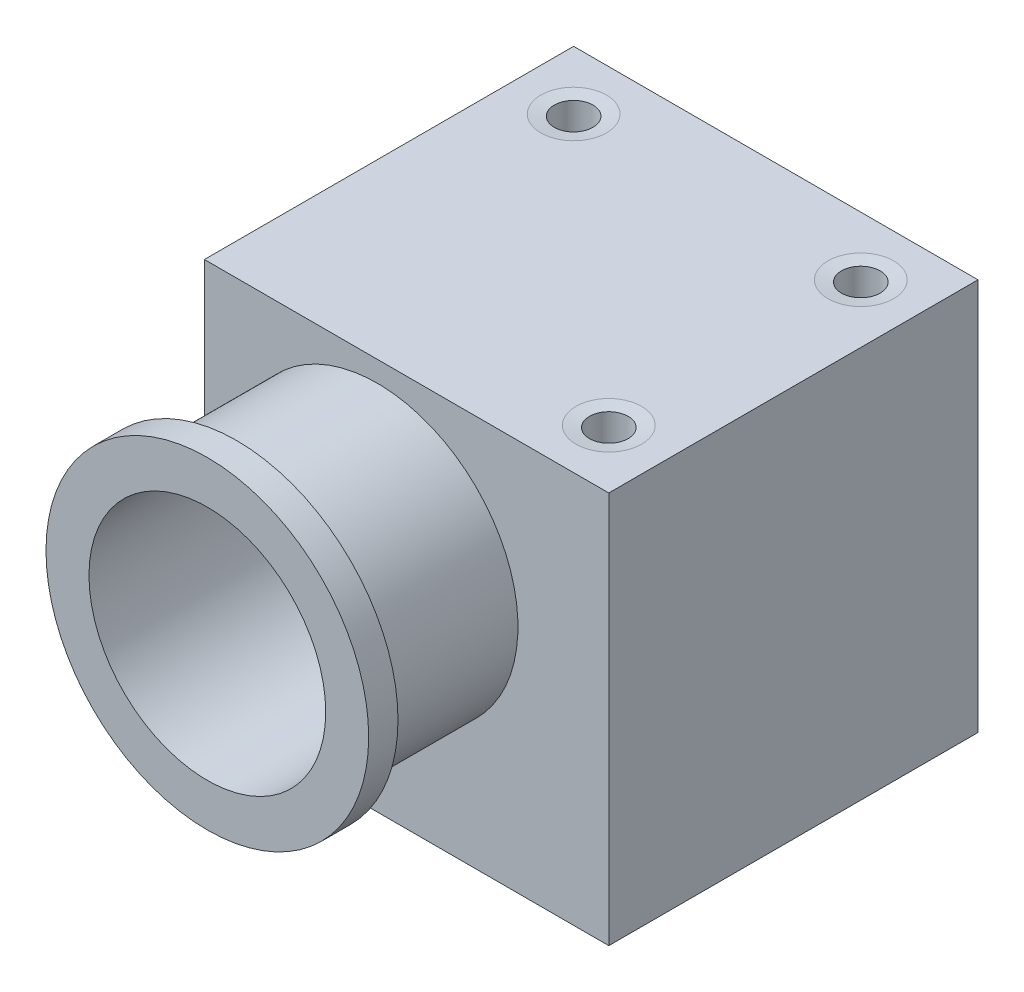
ISO-10303-21;
HEADER;
FILE_DESCRIPTION(('STEP AP214'),'2;1');
FILE_NAME('part.step','',(''),(''),'','','');
FILE_SCHEMA(('AUTOMOTIVE_DESIGN { 1 0 10303 214 1 1 1 1 }'));
ENDSEC;
DATA;
#1=APPLICATION_CONTEXT('core data for automotive mechanical design processes');
#2=APPLICATION_PROTOCOL_DEFINITION('international standard','automotive_design',2000,#1);
#3=PRODUCT_CONTEXT('',#1,'mechanical');
#4=PRODUCT('Part','Part','',(#3));
#5=PRODUCT_RELATED_PRODUCT_CATEGORY('part','',(#4));
#6=PRODUCT_DEFINITION_FORMATION('','',#4);
#7=PRODUCT_DEFINITION_CONTEXT('part definition',#1,'design');
#8=PRODUCT_DEFINITION('design','',#6,#7);
#9=PRODUCT_DEFINITION_SHAPE('','',#8);
#10=(LENGTH_UNIT() NAMED_UNIT(*) SI_UNIT(.MILLI.,.METRE.));
#11=(NAMED_UNIT(*) PLANE_ANGLE_UNIT() SI_UNIT($,.RADIAN.));
#12=(NAMED_UNIT(*) SI_UNIT($,.STERADIAN.) SOLID_ANGLE_UNIT());
#13=UNCERTAINTY_MEASURE_WITH_UNIT(LENGTH_MEASURE(1.E-05),#10,'distance_accuracy_value','');
#14=(GEOMETRIC_REPRESENTATION_CONTEXT(3) GLOBAL_UNCERTAINTY_ASSIGNED_CONTEXT((#13)) GLOBAL_UNIT_ASSIGNED_CONTEXT((#10,
#11,#12)) REPRESENTATION_CONTEXT('',''));
#15=CARTESIAN_POINT('',(0.,0.,0.));
#16=DIRECTION('',(0.,0.,1.));
#17=DIRECTION('',(1.,0.,0.));
#18=AXIS2_PLACEMENT_3D('',#15,#16,#17);
#19=CARTESIAN_POINT('',(7.493,8.49629999997603,-9.906));
#20=DIRECTION('',(0.,1.,0.));
#21=DIRECTION('',(0.,0.,1.));
#22=AXIS2_PLACEMENT_3D('',#19,#20,#21);
#23=CONICAL_SURFACE('',#22,1.42239999990948,1.43116998664493);
#24=CARTESIAN_POINT('',(7.493,8.49629999998414,-9.906));
#25=DIRECTION('',(0.,1.,0.));
#26=DIRECTION('',(0.,0.,1.));
#27=AXIS2_PLACEMENT_3D('',#24,#25,#26);
#28=CIRCLE('',#27,1.42239999996718);
#29=CARTESIAN_POINT('',(7.493,8.49629999998414,-8.48360000003282));
#30=VERTEX_POINT('',#29);
#31=EDGE_CURVE('E22',#30,#30,#28,.T.);
#32=ORIENTED_EDGE('',*,*,#31,.T.);
#33=EDGE_LOOP('',(#32));
#34=FACE_BOUND('',#33,.T.);
#35=CARTESIAN_POINT('',(7.493,8.41419604436572,-9.906));
#36=DIRECTION('',(0.,1.,0.));
#37=DIRECTION('',(0.,0.,1.));
#38=AXIS2_PLACEMENT_3D('',#35,#36,#37);
#39=CIRCLE('',#38,0.8382);
#40=CARTESIAN_POINT('',(7.493,8.41419604436572,-9.0678));
#41=VERTEX_POINT('',#40);
#42=EDGE_CURVE('E100',#41,#41,#39,.F.);
#43=ORIENTED_EDGE('',*,*,#42,.T.);
#44=EDGE_LOOP('',(#43));
#45=FACE_BOUND('',#44,.T.);
#46=ADVANCED_FACE('F19',(#34,#45),#23,.F.);
#47=CARTESIAN_POINT('',(7.493,8.49630000000445,-20.828));
#48=DIRECTION('',(0.,1.,0.));
#49=DIRECTION('',(0.,0.,1.));
#50=AXIS2_PLACEMENT_3D('',#47,#48,#49);
#51=CONICAL_SURFACE('',#50,1.42239999991582,1.43116998660767);
#52=CARTESIAN_POINT('',(7.493,8.49630000001167,-20.828));
#53=DIRECTION('',(0.,1.,0.));
#54=DIRECTION('',(0.,0.,1.));
#55=AXIS2_PLACEMENT_3D('',#52,#53,#54);
#56=CIRCLE('',#55,1.42239999996718);
#57=CARTESIAN_POINT('',(7.493,8.49630000001167,-19.4056000000328));
#58=VERTEX_POINT('',#57);
#59=EDGE_CURVE('E138',#58,#58,#56,.T.);
#60=ORIENTED_EDGE('',*,*,#59,.T.);
#61=EDGE_LOOP('',(#60));
#62=FACE_BOUND('',#61,.T.);
#63=CARTESIAN_POINT('',(7.493,8.41419604436572,-20.828));
#64=DIRECTION('',(0.,1.,0.));
#65=DIRECTION('',(0.,0.,1.));
#66=AXIS2_PLACEMENT_3D('',#63,#64,#65);
#67=CIRCLE('',#66,0.8382);
#68=CARTESIAN_POINT('',(7.493,8.41419604436572,-19.9898));
#69=VERTEX_POINT('',#68);
#70=EDGE_CURVE('E97',#69,#69,#67,.F.);
#71=ORIENTED_EDGE('',*,*,#70,.T.);
#72=EDGE_LOOP('',(#71));
#73=FACE_BOUND('',#72,.T.);
#74=ADVANCED_FACE('F345',(#62,#73),#51,.F.);
#75=CARTESIAN_POINT('',(-4.953,8.49630000000445,-20.828));
#76=DIRECTION('',(0.,1.,0.));
#77=DIRECTION('',(0.,0.,1.));
#78=AXIS2_PLACEMENT_3D('',#75,#76,#77);
#79=CONICAL_SURFACE('',#78,1.42239999991582,1.43116998660767);
#80=CARTESIAN_POINT('',(-4.953,8.49630000001167,-20.828));
#81=DIRECTION('',(0.,1.,0.));
#82=DIRECTION('',(0.,0.,1.));
#83=AXIS2_PLACEMENT_3D('',#80,#81,#82);
#84=CIRCLE('',#83,1.42239999996718);
#85=CARTESIAN_POINT('',(-4.953,8.49630000001167,-19.4056000000328));
#86=VERTEX_POINT('',#85);
#87=EDGE_CURVE('E93',#86,#86,#84,.T.);
#88=ORIENTED_EDGE('',*,*,#87,.T.);
#89=EDGE_LOOP('',(#88));
#90=FACE_BOUND('',#89,.T.);
#91=CARTESIAN_POINT('',(-4.953,8.41419604436572,-20.828));
#92=DIRECTION('',(0.,1.,0.));
#93=DIRECTION('',(0.,0.,1.));
#94=AXIS2_PLACEMENT_3D('',#91,#92,#93);
#95=CIRCLE('',#94,0.8382);
#96=CARTESIAN_POINT('',(-4.953,8.41419604436572,-19.9898));
#97=VERTEX_POINT('',#96);
#98=EDGE_CURVE('E94',#97,#97,#95,.F.);
#99=ORIENTED_EDGE('',*,*,#98,.T.);
#100=EDGE_LOOP('',(#99));
#101=FACE_BOUND('',#100,.T.);
#102=ADVANCED_FACE('F336',(#90,#101),#79,.F.);
#103=CARTESIAN_POINT('',(7.493,-11.8237,-9.906));
#104=DIRECTION('',(0.,1.,0.));
#105=DIRECTION('',(0.,0.,1.));
#106=AXIS2_PLACEMENT_3D('',#103,#104,#105);
#107=CYLINDRICAL_SURFACE('',#106,0.8382);
#108=ORIENTED_EDGE('',*,*,#42,.F.);
#109=EDGE_LOOP('',(#108));
#110=FACE_BOUND('',#109,.T.);
#111=CARTESIAN_POINT('',(7.493,-8.4963,-9.906));
#112=DIRECTION('',(0.,1.,0.));
#113=DIRECTION('',(0.,0.,1.));
#114=AXIS2_PLACEMENT_3D('',#111,#112,#113);
#115=CIRCLE('',#114,0.8382);
#116=CARTESIAN_POINT('',(7.493,-8.4963,-9.0678));
#117=VERTEX_POINT('',#116);
#118=EDGE_CURVE('E70',#117,#117,#115,.T.);
#119=ORIENTED_EDGE('',*,*,#118,.F.);
#120=EDGE_LOOP('',(#119));
#121=FACE_BOUND('',#120,.T.);
#122=ADVANCED_FACE('F327',(#110,#121),#107,.F.);
#123=CARTESIAN_POINT('',(7.493,-11.8237,-20.828));
#124=DIRECTION('',(0.,1.,0.));
#125=DIRECTION('',(0.,0.,1.));
#126=AXIS2_PLACEMENT_3D('',#123,#124,#125);
#127=CYLINDRICAL_SURFACE('',#126,0.8382);
#128=ORIENTED_EDGE('',*,*,#70,.F.);
#129=EDGE_LOOP('',(#128));
#130=FACE_BOUND('',#129,.T.);
#131=CARTESIAN_POINT('',(7.493,-8.4963,-20.828));
#132=DIRECTION('',(0.,1.,0.));
#133=DIRECTION('',(0.,0.,1.));
#134=AXIS2_PLACEMENT_3D('',#131,#132,#133);
#135=CIRCLE('',#134,0.8382);
#136=CARTESIAN_POINT('',(7.493,-8.4963,-19.9898));
#137=VERTEX_POINT('',#136);
#138=EDGE_CURVE('E132',#137,#137,#135,.T.);
#139=ORIENTED_EDGE('',*,*,#138,.F.);
#140=EDGE_LOOP('',(#139));
#141=FACE_BOUND('',#140,.T.);
#142=ADVANCED_FACE('F318',(#130,#141),#127,.F.);
#143=CARTESIAN_POINT('',(-4.953,-11.8237,-20.828));
#144=DIRECTION('',(0.,1.,0.));
#145=DIRECTION('',(0.,0.,1.));
#146=AXIS2_PLACEMENT_3D('',#143,#144,#145);
#147=CYLINDRICAL_SURFACE('',#146,0.8382);
#148=ORIENTED_EDGE('',*,*,#98,.F.);
#149=EDGE_LOOP('',(#148));
#150=FACE_BOUND('',#149,.T.);
#151=CARTESIAN_POINT('',(-4.953,-8.4963,-20.828));
#152=DIRECTION('',(0.,1.,0.));
#153=DIRECTION('',(0.,0.,1.));
#154=AXIS2_PLACEMENT_3D('',#151,#152,#153);
#155=CIRCLE('',#154,0.8382);
#156=CARTESIAN_POINT('',(-4.953,-8.4963,-19.9898));
#157=VERTEX_POINT('',#156);
#158=EDGE_CURVE('E90',#157,#157,#155,.T.);
#159=ORIENTED_EDGE('',*,*,#158,.F.);
#160=EDGE_LOOP('',(#159));
#161=FACE_BOUND('',#160,.T.);
#162=ADVANCED_FACE('F150',(#150,#161),#147,.F.);
#163=CARTESIAN_POINT('',(-7.493,8.4963,-24.1554));
#164=DIRECTION('',(0.,-1.,0.));
#165=DIRECTION('',(0.,0.,-1.));
#166=AXIS2_PLACEMENT_3D('',#163,#164,#165);
#167=PLANE('',#166);
#168=ORIENTED_EDGE('',*,*,#87,.F.);
#169=EDGE_LOOP('',(#168));
#170=FACE_BOUND('',#169,.T.);
#171=ORIENTED_EDGE('',*,*,#59,.F.);
#172=EDGE_LOOP('',(#171));
#173=FACE_BOUND('',#172,.T.);
#174=ORIENTED_EDGE('',*,*,#31,.F.);
#175=EDGE_LOOP('',(#174));
#176=FACE_BOUND('',#175,.T.);
#177=DIRECTION('',(1.,0.,0.));
#178=VECTOR('',#177,1.);
#179=CARTESIAN_POINT('',(0.,8.4963,-7.366));
#180=LINE('',#179,#178);
#181=CARTESIAN_POINT('',(10.033,8.4963,-7.366));
#182=VERTEX_POINT('',#181);
#183=CARTESIAN_POINT('',(-7.493,8.4963,-7.366));
#184=VERTEX_POINT('',#183);
#185=EDGE_CURVE('E82',#182,#184,#180,.F.);
#186=ORIENTED_EDGE('',*,*,#185,.F.);
#187=DIRECTION('',(0.,0.,-1.));
#188=VECTOR('',#187,1.);
#189=CARTESIAN_POINT('',(10.033,8.4963,0.));
#190=LINE('',#189,#188);
#191=CARTESIAN_POINT('',(10.033,8.4963,-23.368));
#192=VERTEX_POINT('',#191);
#193=EDGE_CURVE('E71',#192,#182,#190,.F.);
#194=ORIENTED_EDGE('',*,*,#193,.F.);
#195=DIRECTION('',(-1.,0.,0.));
#196=VECTOR('',#195,1.);
#197=CARTESIAN_POINT('',(0.,8.4963,-23.368));
#198=LINE('',#197,#196);
#199=CARTESIAN_POINT('',(-7.493,8.4963,-23.368));
#200=VERTEX_POINT('',#199);
#201=EDGE_CURVE('E154',#200,#192,#198,.F.);
#202=ORIENTED_EDGE('',*,*,#201,.F.);
#203=DIRECTION('',(0.,0.,-1.));
#204=VECTOR('',#203,1.);
#205=CARTESIAN_POINT('',(-7.493,8.4963,-24.1554));
#206=LINE('',#205,#204);
#207=EDGE_CURVE('E88',#200,#184,#206,.F.);
#208=ORIENTED_EDGE('',*,*,#207,.T.);
#209=EDGE_LOOP('',(#186,#194,#202,#208));
#210=FACE_BOUND('',#209,.T.);
#211=ADVANCED_FACE('F147',(#170,#173,#176,#210),#167,.F.);
#212=CARTESIAN_POINT('',(10.033,0.,0.));
#213=DIRECTION('',(1.,0.,0.));
#214=DIRECTION('',(0.,0.,-1.));
#215=AXIS2_PLACEMENT_3D('',#212,#213,#214);
#216=PLANE('',#215);
#217=ORIENTED_EDGE('',*,*,#193,.T.);
#218=DIRECTION('',(0.,1.,0.));
#219=VECTOR('',#218,1.);
#220=CARTESIAN_POINT('',(10.033,0.,-7.366));
#221=LINE('',#220,#219);
#222=CARTESIAN_POINT('',(10.033,-8.4963,-7.366));
#223=VERTEX_POINT('',#222);
#224=EDGE_CURVE('E76',#223,#182,#221,.T.);
#225=ORIENTED_EDGE('',*,*,#224,.F.);
#226=DIRECTION('',(0.,0.,-1.));
#227=VECTOR('',#226,1.);
#228=CARTESIAN_POINT('',(10.033,-8.4963,-24.1554));
#229=LINE('',#228,#227);
#230=CARTESIAN_POINT('',(10.033,-8.4963,-23.368));
#231=VERTEX_POINT('',#230);
#232=EDGE_CURVE('E63',#231,#223,#229,.F.);
#233=ORIENTED_EDGE('',*,*,#232,.F.);
#234=DIRECTION('',(0.,1.,0.));
#235=VECTOR('',#234,1.);
#236=CARTESIAN_POINT('',(10.033,0.,-23.368));
#237=LINE('',#236,#235);
#238=EDGE_CURVE('E156',#192,#231,#237,.F.);
#239=ORIENTED_EDGE('',*,*,#238,.F.);
#240=EDGE_LOOP('',(#217,#225,#233,#239));
#241=FACE_BOUND('',#240,.T.);
#242=ADVANCED_FACE('F80',(#241),#216,.T.);
#243=CARTESIAN_POINT('',(-7.493,-8.4963,-24.1554));
#244=DIRECTION('',(0.,-1.,0.));
#245=DIRECTION('',(0.,0.,-1.));
#246=AXIS2_PLACEMENT_3D('',#243,#244,#245);
#247=PLANE('',#246);
#248=ORIENTED_EDGE('',*,*,#158,.T.);
#249=EDGE_LOOP('',(#248));
#250=FACE_BOUND('',#249,.T.);
#251=ORIENTED_EDGE('',*,*,#138,.T.);
#252=EDGE_LOOP('',(#251));
#253=FACE_BOUND('',#252,.T.);
#254=ORIENTED_EDGE('',*,*,#118,.T.);
#255=EDGE_LOOP('',(#254));
#256=FACE_BOUND('',#255,.T.);
#257=DIRECTION('',(1.,0.,0.));
#258=VECTOR('',#257,1.);
#259=CARTESIAN_POINT('',(0.,-8.4963,-7.366));
#260=LINE('',#259,#258);
#261=CARTESIAN_POINT('',(-7.493,-8.4963,-7.366));
#262=VERTEX_POINT('',#261);
#263=EDGE_CURVE('E66',#262,#223,#260,.T.);
#264=ORIENTED_EDGE('',*,*,#263,.F.);
#265=DIRECTION('',(0.,0.,-1.));
#266=VECTOR('',#265,1.);
#267=CARTESIAN_POINT('',(-7.493,-8.4963,-24.1554));
#268=LINE('',#267,#266);
#269=CARTESIAN_POINT('',(-7.493,-8.4963,-23.368));
#270=VERTEX_POINT('',#269);
#271=EDGE_CURVE('E57',#262,#270,#268,.T.);
#272=ORIENTED_EDGE('',*,*,#271,.T.);
#273=DIRECTION('',(-1.,0.,0.));
#274=VECTOR('',#273,1.);
#275=CARTESIAN_POINT('',(0.,-8.4963,-23.368));
#276=LINE('',#275,#274);
#277=EDGE_CURVE('E37',#231,#270,#276,.T.);
#278=ORIENTED_EDGE('',*,*,#277,.F.);
#279=ORIENTED_EDGE('',*,*,#232,.T.);
#280=EDGE_LOOP('',(#264,#272,#278,#279));
#281=FACE_BOUND('',#280,.T.);
#282=ADVANCED_FACE('F65',(#250,#253,#256,#281),#247,.T.);
#283=CARTESIAN_POINT('',(-7.493,-8.4963,-24.1554));
#284=DIRECTION('',(1.,0.,0.));
#285=DIRECTION('',(0.,0.,-1.));
#286=AXIS2_PLACEMENT_3D('',#283,#284,#285);
#287=PLANE('',#286);
#288=DIRECTION('',(0.,1.,0.));
#289=VECTOR('',#288,1.);
#290=CARTESIAN_POINT('',(-7.493,0.,-7.366));
#291=LINE('',#290,#289);
#292=EDGE_CURVE('E78',#184,#262,#291,.F.);
#293=ORIENTED_EDGE('',*,*,#292,.F.);
#294=ORIENTED_EDGE('',*,*,#207,.F.);
#295=DIRECTION('',(0.,1.,0.));
#296=VECTOR('',#295,1.);
#297=CARTESIAN_POINT('',(-7.493,0.,-23.368));
#298=LINE('',#297,#296);
#299=EDGE_CURVE('E129',#270,#200,#298,.T.);
#300=ORIENTED_EDGE('',*,*,#299,.F.);
#301=ORIENTED_EDGE('',*,*,#271,.F.);
#302=EDGE_LOOP('',(#293,#294,#300,#301));
#303=FACE_BOUND('',#302,.T.);
#304=ADVANCED_FACE('F155',(#303),#287,.F.);
#305=CARTESIAN_POINT('',(0.,0.,-7.366));
#306=DIRECTION('',(0.,0.,1.));
#307=DIRECTION('',(1.,0.,0.));
#308=AXIS2_PLACEMENT_3D('',#305,#306,#307);
#309=PLANE('',#308);
#310=CARTESIAN_POINT('',(0.,1.50369999999988,-7.366));
#311=DIRECTION('',(0.,0.,-1.));
#312=DIRECTION('',(-1.,0.,0.));
#313=AXIS2_PLACEMENT_3D('',#310,#311,#312);
#314=CIRCLE('',#313,6.096);
#315=CARTESIAN_POINT('',(-6.096,1.50369999999988,-7.366));
#316=VERTEX_POINT('',#315);
#317=EDGE_CURVE('E126',#316,#316,#314,.F.);
#318=ORIENTED_EDGE('',*,*,#317,.F.);
#319=EDGE_LOOP('',(#318));
#320=FACE_BOUND('',#319,.T.);
#321=ORIENTED_EDGE('',*,*,#185,.T.);
#322=ORIENTED_EDGE('',*,*,#292,.T.);
#323=ORIENTED_EDGE('',*,*,#263,.T.);
#324=ORIENTED_EDGE('',*,*,#224,.T.);
#325=EDGE_LOOP('',(#321,#322,#323,#324));
#326=FACE_BOUND('',#325,.T.);
#327=ADVANCED_FACE('F75',(#320,#326),#309,.T.);
#328=CARTESIAN_POINT('',(0.,0.,-23.368));
#329=DIRECTION('',(0.,0.,-1.));
#330=DIRECTION('',(-1.,0.,0.));
#331=AXIS2_PLACEMENT_3D('',#328,#329,#330);
#332=PLANE('',#331);
#333=CARTESIAN_POINT('',(0.,1.50369999999988,-23.368));
#334=DIRECTION('',(0.,0.,1.));
#335=DIRECTION('',(1.,0.,0.));
#336=AXIS2_PLACEMENT_3D('',#333,#334,#335);
#337=CIRCLE('',#336,1.4224);
#338=CARTESIAN_POINT('',(1.4224,1.50369999999988,-23.368));
#339=VERTEX_POINT('',#338);
#340=EDGE_CURVE('E123',#339,#339,#337,.T.);
#341=ORIENTED_EDGE('',*,*,#340,.T.);
#342=EDGE_LOOP('',(#341));
#343=FACE_BOUND('',#342,.T.);
#344=ORIENTED_EDGE('',*,*,#277,.T.);
#345=ORIENTED_EDGE('',*,*,#299,.T.);
#346=ORIENTED_EDGE('',*,*,#201,.T.);
#347=ORIENTED_EDGE('',*,*,#238,.T.);
#348=EDGE_LOOP('',(#344,#345,#346,#347));
#349=FACE_BOUND('',#348,.T.);
#350=ADVANCED_FACE('F161',(#343,#349),#332,.T.);
#351=CARTESIAN_POINT('',(0.,1.50369999999988,-1.27));
#352=DIRECTION('',(0.,0.,-1.));
#353=DIRECTION('',(-1.,0.,0.));
#354=AXIS2_PLACEMENT_3D('',#351,#352,#353);
#355=CYLINDRICAL_SURFACE('',#354,6.096);
#356=ORIENTED_EDGE('',*,*,#317,.T.);
#357=EDGE_LOOP('',(#356));
#358=FACE_BOUND('',#357,.T.);
#359=CARTESIAN_POINT('',(0.,1.50369999999988,-1.27));
#360=DIRECTION('',(0.,0.,-1.));
#361=DIRECTION('',(-1.,0.,0.));
#362=AXIS2_PLACEMENT_3D('',#359,#360,#361);
#363=CIRCLE('',#362,6.096);
#364=CARTESIAN_POINT('',(-6.096,1.50369999999988,-1.27));
#365=VERTEX_POINT('',#364);
#366=EDGE_CURVE('E120',#365,#365,#363,.T.);
#367=ORIENTED_EDGE('',*,*,#366,.T.);
#368=EDGE_LOOP('',(#367));
#369=FACE_BOUND('',#368,.T.);
#370=ADVANCED_FACE('F163',(#358,#369),#355,.T.);
#371=CARTESIAN_POINT('',(0.,1.50369999999988,-24.1554));
#372=DIRECTION('',(0.,0.,1.));
#373=DIRECTION('',(1.,0.,0.));
#374=AXIS2_PLACEMENT_3D('',#371,#372,#373);
#375=CYLINDRICAL_SURFACE('',#374,1.4224);
#376=CARTESIAN_POINT('',(0.,1.50369999999988,-19.558));
#377=DIRECTION('',(0.,0.,1.));
#378=DIRECTION('',(1.,0.,0.));
#379=AXIS2_PLACEMENT_3D('',#376,#377,#378);
#380=CIRCLE('',#379,1.4224);
#381=CARTESIAN_POINT('',(1.4224,1.50369999999988,-19.558));
#382=VERTEX_POINT('',#381);
#383=EDGE_CURVE('E117',#382,#382,#380,.F.);
#384=ORIENTED_EDGE('',*,*,#383,.F.);
#385=EDGE_LOOP('',(#384));
#386=FACE_BOUND('',#385,.T.);
#387=ORIENTED_EDGE('',*,*,#340,.F.);
#388=EDGE_LOOP('',(#387));
#389=FACE_BOUND('',#388,.T.);
#390=ADVANCED_FACE('F171',(#386,#389),#375,.F.);
#391=CARTESIAN_POINT('',(0.,1.50369999999988,-1.27));
#392=DIRECTION('',(0.,0.,1.));
#393=DIRECTION('',(1.,0.,0.));
#394=AXIS2_PLACEMENT_3D('',#391,#392,#393);
#395=PLANE('',#394);
#396=ORIENTED_EDGE('',*,*,#366,.F.);
#397=EDGE_LOOP('',(#396));
#398=FACE_BOUND('',#397,.T.);
#399=CARTESIAN_POINT('',(0.,1.50369999999988,-1.27));
#400=DIRECTION('',(0.,0.,-1.));
#401=DIRECTION('',(-1.,0.,0.));
#402=AXIS2_PLACEMENT_3D('',#399,#400,#401);
#403=CIRCLE('',#402,6.99259999999936);
#404=CARTESIAN_POINT('',(-6.99259999999936,1.50369999999988,-1.27));
#405=VERTEX_POINT('',#404);
#406=EDGE_CURVE('E114',#405,#405,#403,.F.);
#407=ORIENTED_EDGE('',*,*,#406,.F.);
#408=EDGE_LOOP('',(#407));
#409=FACE_BOUND('',#408,.T.);
#410=ADVANCED_FACE('F204',(#398,#409),#395,.F.);
#411=CARTESIAN_POINT('',(0.,1.50369999999988,-19.558));
#412=DIRECTION('',(0.,0.,1.));
#413=DIRECTION('',(1.,0.,0.));
#414=AXIS2_PLACEMENT_3D('',#411,#412,#413);
#415=PLANE('',#414);
#416=ORIENTED_EDGE('',*,*,#383,.T.);
#417=EDGE_LOOP('',(#416));
#418=FACE_BOUND('',#417,.T.);
#419=CARTESIAN_POINT('',(0.,1.50369999999988,-19.558));
#420=DIRECTION('',(0.,0.,1.));
#421=DIRECTION('',(1.,0.,0.));
#422=AXIS2_PLACEMENT_3D('',#419,#420,#421);
#423=CIRCLE('',#422,3.2639);
#424=CARTESIAN_POINT('',(3.2639,1.50369999999988,-19.558));
#425=VERTEX_POINT('',#424);
#426=EDGE_CURVE('E111',#425,#425,#423,.T.);
#427=ORIENTED_EDGE('',*,*,#426,.T.);
#428=EDGE_LOOP('',(#427));
#429=FACE_BOUND('',#428,.T.);
#430=ADVANCED_FACE('F200',(#418,#429),#415,.T.);
#431=CARTESIAN_POINT('',(0.,1.50369999999988,0.));
#432=DIRECTION('',(0.,0.,-1.));
#433=DIRECTION('',(-1.,0.,0.));
#434=AXIS2_PLACEMENT_3D('',#431,#432,#433);
#435=CYLINDRICAL_SURFACE('',#434,6.99259999999936);
#436=ORIENTED_EDGE('',*,*,#406,.T.);
#437=EDGE_LOOP('',(#436));
#438=FACE_BOUND('',#437,.T.);
#439=CARTESIAN_POINT('',(0.,1.50369999999988,0.));
#440=DIRECTION('',(0.,0.,-1.));
#441=DIRECTION('',(-1.,0.,0.));
#442=AXIS2_PLACEMENT_3D('',#439,#440,#441);
#443=CIRCLE('',#442,6.99259999999936);
#444=CARTESIAN_POINT('',(-6.99259999999936,1.50369999999988,0.));
#445=VERTEX_POINT('',#444);
#446=EDGE_CURVE('E108',#445,#445,#443,.F.);
#447=ORIENTED_EDGE('',*,*,#446,.F.);
#448=EDGE_LOOP('',(#447));
#449=FACE_BOUND('',#448,.T.);
#450=ADVANCED_FACE('F196',(#438,#449),#435,.T.);
#451=CARTESIAN_POINT('',(0.,1.50369999999988,-19.558));
#452=DIRECTION('',(0.,0.,1.));
#453=DIRECTION('',(1.,0.,0.));
#454=AXIS2_PLACEMENT_3D('',#451,#452,#453);
#455=CYLINDRICAL_SURFACE('',#454,3.2639);
#456=CARTESIAN_POINT('',(0.,1.50369999999988,-18.288));
#457=DIRECTION('',(0.,0.,1.));
#458=DIRECTION('',(1.,0.,0.));
#459=AXIS2_PLACEMENT_3D('',#456,#457,#458);
#460=CIRCLE('',#459,3.2639);
#461=CARTESIAN_POINT('',(3.2639,1.50369999999988,-18.288));
#462=VERTEX_POINT('',#461);
#463=EDGE_CURVE('E105',#462,#462,#460,.F.);
#464=ORIENTED_EDGE('',*,*,#463,.F.);
#465=EDGE_LOOP('',(#464));
#466=FACE_BOUND('',#465,.T.);
#467=ORIENTED_EDGE('',*,*,#426,.F.);
#468=EDGE_LOOP('',(#467));
#469=FACE_BOUND('',#468,.T.);
#470=ADVANCED_FACE('F192',(#466,#469),#455,.F.);
#471=CARTESIAN_POINT('',(0.,1.50369999999988,0.));
#472=DIRECTION('',(0.,0.,1.));
#473=DIRECTION('',(1.,0.,0.));
#474=AXIS2_PLACEMENT_3D('',#471,#472,#473);
#475=PLANE('',#474);
#476=CARTESIAN_POINT('',(0.,1.50369999999988,0.));
#477=DIRECTION('',(0.,0.,1.));
#478=DIRECTION('',(1.,0.,0.));
#479=AXIS2_PLACEMENT_3D('',#476,#477,#478);
#480=CIRCLE('',#479,5.1308);
#481=CARTESIAN_POINT('',(5.1308,1.50369999999988,0.));
#482=VERTEX_POINT('',#481);
#483=EDGE_CURVE('E28',#482,#482,#480,.F.);
#484=ORIENTED_EDGE('',*,*,#483,.T.);
#485=EDGE_LOOP('',(#484));
#486=FACE_BOUND('',#485,.T.);
#487=ORIENTED_EDGE('',*,*,#446,.T.);
#488=EDGE_LOOP('',(#487));
#489=FACE_BOUND('',#488,.T.);
#490=ADVANCED_FACE('F184',(#486,#489),#475,.T.);
#491=CARTESIAN_POINT('',(0.,1.50369999999988,-18.288));
#492=DIRECTION('',(0.,0.,1.));
#493=DIRECTION('',(1.,0.,0.));
#494=AXIS2_PLACEMENT_3D('',#491,#492,#493);
#495=PLANE('',#494);
#496=ORIENTED_EDGE('',*,*,#463,.T.);
#497=EDGE_LOOP('',(#496));
#498=FACE_BOUND('',#497,.T.);
#499=CARTESIAN_POINT('',(0.,1.50369999999988,-18.288));
#500=DIRECTION('',(0.,0.,1.));
#501=DIRECTION('',(1.,0.,0.));
#502=AXIS2_PLACEMENT_3D('',#499,#500,#501);
#503=CIRCLE('',#502,5.1308);
#504=CARTESIAN_POINT('',(5.1308,1.50369999999988,-18.288));
#505=VERTEX_POINT('',#504);
#506=EDGE_CURVE('E11',#505,#505,#503,.T.);
#507=ORIENTED_EDGE('',*,*,#506,.T.);
#508=EDGE_LOOP('',(#507));
#509=FACE_BOUND('',#508,.T.);
#510=ADVANCED_FACE('F178',(#498,#509),#495,.T.);
#511=CARTESIAN_POINT('',(0.,1.50369999999988,-18.288));
#512=DIRECTION('',(0.,0.,1.));
#513=DIRECTION('',(1.,0.,0.));
#514=AXIS2_PLACEMENT_3D('',#511,#512,#513);
#515=CYLINDRICAL_SURFACE('',#514,5.1308);
#516=ORIENTED_EDGE('',*,*,#483,.F.);
#517=EDGE_LOOP('',(#516));
#518=FACE_BOUND('',#517,.T.);
#519=ORIENTED_EDGE('',*,*,#506,.F.);
#520=EDGE_LOOP('',(#519));
#521=FACE_BOUND('',#520,.T.);
#522=ADVANCED_FACE('F176',(#518,#521),#515,.F.);
#523=CLOSED_SHELL('',(#46,#74,#102,#122,#142,#162,#211,#242,#282,#304,#327,#350,#370,#390,#410,
#430,#450,#470,#490,#510,#522));
#524=MANIFOLD_SOLID_BREP('B1',#523);
#525=ADVANCED_BREP_SHAPE_REPRESENTATION('',(#18,#524),#14);
#526=SHAPE_DEFINITION_REPRESENTATION(#9,#525);
ENDSEC;
END-ISO-10303-21;
